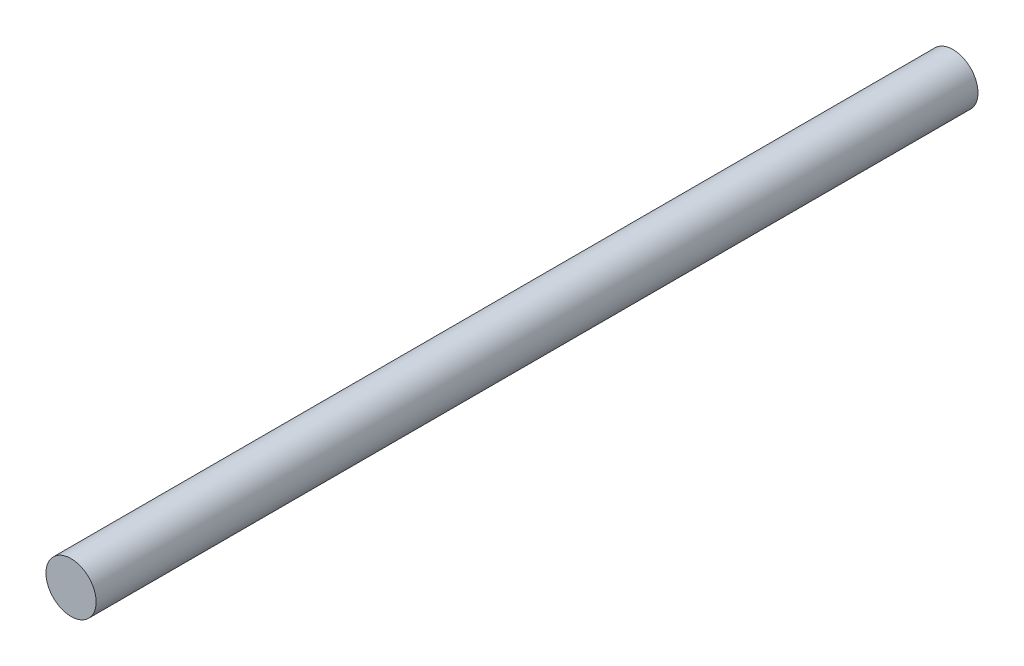
ISO-10303-21;
HEADER;
FILE_DESCRIPTION(('STEP AP214'),'2;1');
FILE_NAME('part.step','',(''),(''),'','','');
FILE_SCHEMA(('AUTOMOTIVE_DESIGN { 1 0 10303 214 1 1 1 1 }'));
ENDSEC;
DATA;
#1=APPLICATION_CONTEXT('core data for automotive mechanical design processes');
#2=APPLICATION_PROTOCOL_DEFINITION('international standard','automotive_design',2000,#1);
#3=PRODUCT_CONTEXT('',#1,'mechanical');
#4=PRODUCT('Part','Part','',(#3));
#5=PRODUCT_RELATED_PRODUCT_CATEGORY('part','',(#4));
#6=PRODUCT_DEFINITION_FORMATION('','',#4);
#7=PRODUCT_DEFINITION_CONTEXT('part definition',#1,'design');
#8=PRODUCT_DEFINITION('design','',#6,#7);
#9=PRODUCT_DEFINITION_SHAPE('','',#8);
#10=(LENGTH_UNIT() NAMED_UNIT(*) SI_UNIT(.MILLI.,.METRE.));
#11=(NAMED_UNIT(*) PLANE_ANGLE_UNIT() SI_UNIT($,.RADIAN.));
#12=(NAMED_UNIT(*) SI_UNIT($,.STERADIAN.) SOLID_ANGLE_UNIT());
#13=UNCERTAINTY_MEASURE_WITH_UNIT(LENGTH_MEASURE(1.E-05),#10,'distance_accuracy_value','');
#14=(GEOMETRIC_REPRESENTATION_CONTEXT(3) GLOBAL_UNCERTAINTY_ASSIGNED_CONTEXT((#13)) GLOBAL_UNIT_ASSIGNED_CONTEXT((#10,
#11,#12)) REPRESENTATION_CONTEXT('',''));
#15=CARTESIAN_POINT('',(0.,0.,0.));
#16=DIRECTION('',(0.,0.,1.));
#17=DIRECTION('',(1.,0.,0.));
#18=AXIS2_PLACEMENT_3D('',#15,#16,#17);
#19=CARTESIAN_POINT('',(0.,0.,52.75));
#20=DIRECTION('',(0.,0.,-1.));
#21=DIRECTION('',(-1.,0.,0.));
#22=AXIS2_PLACEMENT_3D('',#19,#20,#21);
#23=CYLINDRICAL_SURFACE('',#22,1.5);
#24=CARTESIAN_POINT('',(0.,0.,52.75));
#25=DIRECTION('',(0.,0.,1.));
#26=DIRECTION('',(1.,0.,0.));
#27=AXIS2_PLACEMENT_3D('',#24,#25,#26);
#28=CIRCLE('',#27,1.5);
#29=CARTESIAN_POINT('',(1.5,0.,52.75));
#30=VERTEX_POINT('',#29);
#31=EDGE_CURVE('E10',#30,#30,#28,.T.);
#32=ORIENTED_EDGE('',*,*,#31,.F.);
#33=EDGE_LOOP('',(#32));
#34=FACE_BOUND('',#33,.T.);
#35=CARTESIAN_POINT('',(0.,0.,0.));
#36=DIRECTION('',(0.,0.,1.));
#37=DIRECTION('',(1.,0.,0.));
#38=AXIS2_PLACEMENT_3D('',#35,#36,#37);
#39=CIRCLE('',#38,1.5);
#40=CARTESIAN_POINT('',(1.5,0.,0.));
#41=VERTEX_POINT('',#40);
#42=EDGE_CURVE('E38',#41,#41,#39,.T.);
#43=ORIENTED_EDGE('',*,*,#42,.T.);
#44=EDGE_LOOP('',(#43));
#45=FACE_BOUND('',#44,.T.);
#46=ADVANCED_FACE('F35',(#34,#45),#23,.T.);
#47=CARTESIAN_POINT('',(0.,0.,52.75));
#48=DIRECTION('',(0.,0.,1.));
#49=DIRECTION('',(1.,0.,0.));
#50=AXIS2_PLACEMENT_3D('',#47,#48,#49);
#51=PLANE('',#50);
#52=ORIENTED_EDGE('',*,*,#31,.T.);
#53=EDGE_LOOP('',(#52));
#54=FACE_BOUND('',#53,.T.);
#55=ADVANCED_FACE('F50',(#54),#51,.T.);
#56=CARTESIAN_POINT('',(0.,0.,0.));
#57=DIRECTION('',(0.,0.,1.));
#58=DIRECTION('',(1.,0.,0.));
#59=AXIS2_PLACEMENT_3D('',#56,#57,#58);
#60=PLANE('',#59);
#61=ORIENTED_EDGE('',*,*,#42,.F.);
#62=EDGE_LOOP('',(#61));
#63=FACE_BOUND('',#62,.T.);
#64=ADVANCED_FACE('F48',(#63),#60,.F.);
#65=CLOSED_SHELL('',(#46,#55,#64));
#66=MANIFOLD_SOLID_BREP('B2',#65);
#67=ADVANCED_BREP_SHAPE_REPRESENTATION('',(#18,#66),#14);
#68=SHAPE_DEFINITION_REPRESENTATION(#9,#67);
ENDSEC;
END-ISO-10303-21;
